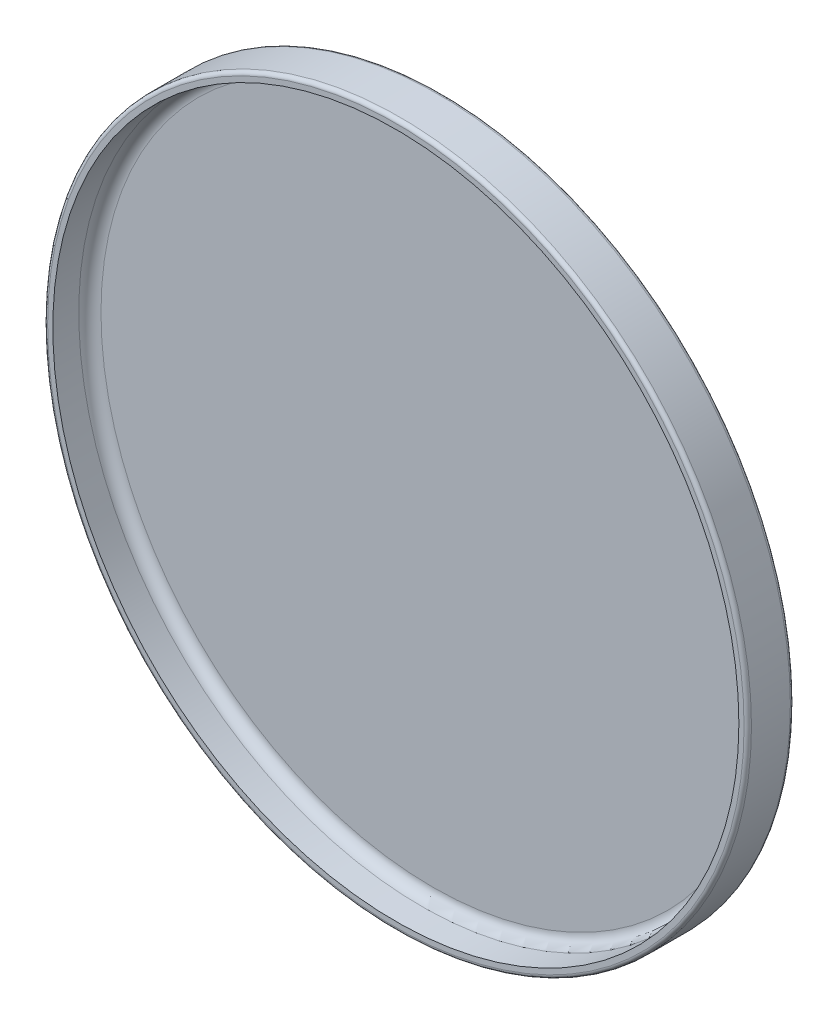
ISO-10303-21;
HEADER;
FILE_DESCRIPTION(('STEP AP214'),'2;1');
FILE_NAME('part.step','',(''),(''),'','','');
FILE_SCHEMA(('AUTOMOTIVE_DESIGN { 1 0 10303 214 1 1 1 1 }'));
ENDSEC;
DATA;
#1=APPLICATION_CONTEXT('core data for automotive mechanical design processes');
#2=APPLICATION_PROTOCOL_DEFINITION('international standard','automotive_design',2000,#1);
#3=PRODUCT_CONTEXT('',#1,'mechanical');
#4=PRODUCT('Part','Part','',(#3));
#5=PRODUCT_RELATED_PRODUCT_CATEGORY('part','',(#4));
#6=PRODUCT_DEFINITION_FORMATION('','',#4);
#7=PRODUCT_DEFINITION_CONTEXT('part definition',#1,'design');
#8=PRODUCT_DEFINITION('design','',#6,#7);
#9=PRODUCT_DEFINITION_SHAPE('','',#8);
#10=(LENGTH_UNIT() NAMED_UNIT(*) SI_UNIT(.MILLI.,.METRE.));
#11=(NAMED_UNIT(*) PLANE_ANGLE_UNIT() SI_UNIT($,.RADIAN.));
#12=(NAMED_UNIT(*) SI_UNIT($,.STERADIAN.) SOLID_ANGLE_UNIT());
#13=UNCERTAINTY_MEASURE_WITH_UNIT(LENGTH_MEASURE(1.E-05),#10,'distance_accuracy_value','');
#14=(GEOMETRIC_REPRESENTATION_CONTEXT(3) GLOBAL_UNCERTAINTY_ASSIGNED_CONTEXT((#13)) GLOBAL_UNIT_ASSIGNED_CONTEXT((#10,
#11,#12)) REPRESENTATION_CONTEXT('',''));
#15=CARTESIAN_POINT('',(0.,0.,0.));
#16=DIRECTION('',(0.,0.,1.));
#17=DIRECTION('',(1.,0.,0.));
#18=AXIS2_PLACEMENT_3D('',#15,#16,#17);
#19=CARTESIAN_POINT('',(0.,0.,-2.5));
#20=DIRECTION('',(0.,0.,1.));
#21=DIRECTION('',(1.,0.,0.));
#22=AXIS2_PLACEMENT_3D('',#19,#20,#21);
#23=CYLINDRICAL_SURFACE('',#22,95.);
#24=CARTESIAN_POINT('',(0.,0.,9.));
#25=DIRECTION('',(0.,0.,1.));
#26=DIRECTION('',(1.,0.,0.));
#27=AXIS2_PLACEMENT_3D('',#24,#25,#26);
#28=CIRCLE('',#27,95.);
#29=CARTESIAN_POINT('',(95.,0.,9.));
#30=VERTEX_POINT('',#29);
#31=EDGE_CURVE('E43',#30,#30,#28,.F.);
#32=ORIENTED_EDGE('',*,*,#31,.T.);
#33=EDGE_LOOP('',(#32));
#34=FACE_BOUND('',#33,.T.);
#35=CARTESIAN_POINT('',(0.,0.,-1.5));
#36=DIRECTION('',(0.,0.,1.));
#37=DIRECTION('',(1.,0.,0.));
#38=AXIS2_PLACEMENT_3D('',#35,#36,#37);
#39=CIRCLE('',#38,95.);
#40=CARTESIAN_POINT('',(95.,0.,-1.5));
#41=VERTEX_POINT('',#40);
#42=EDGE_CURVE('E55',#41,#41,#39,.T.);
#43=ORIENTED_EDGE('',*,*,#42,.T.);
#44=EDGE_LOOP('',(#43));
#45=FACE_BOUND('',#44,.T.);
#46=ADVANCED_FACE('F32',(#34,#45),#23,.T.);
#47=CARTESIAN_POINT('',(0.,0.,-2.5));
#48=DIRECTION('',(0.,0.,1.));
#49=DIRECTION('',(1.,0.,0.));
#50=AXIS2_PLACEMENT_3D('',#47,#48,#49);
#51=PLANE('',#50);
#52=CARTESIAN_POINT('',(0.,0.,-2.5));
#53=DIRECTION('',(0.,0.,1.));
#54=DIRECTION('',(1.,0.,0.));
#55=AXIS2_PLACEMENT_3D('',#52,#53,#54);
#56=CIRCLE('',#55,94.);
#57=CARTESIAN_POINT('',(94.,0.,-2.5));
#58=VERTEX_POINT('',#57);
#59=EDGE_CURVE('E52',#58,#58,#56,.F.);
#60=ORIENTED_EDGE('',*,*,#59,.T.);
#61=EDGE_LOOP('',(#60));
#62=FACE_BOUND('',#61,.T.);
#63=ADVANCED_FACE('F75',(#62),#51,.F.);
#64=CARTESIAN_POINT('',(0.,0.,10.));
#65=DIRECTION('',(0.,0.,-1.));
#66=DIRECTION('',(-1.,0.,0.));
#67=AXIS2_PLACEMENT_3D('',#64,#65,#66);
#68=CYLINDRICAL_SURFACE('',#67,92.6);
#69=CARTESIAN_POINT('',(0.,0.,3.));
#70=DIRECTION('',(0.,0.,1.));
#71=DIRECTION('',(1.,0.,0.));
#72=AXIS2_PLACEMENT_3D('',#69,#70,#71);
#73=CIRCLE('',#72,92.6);
#74=CARTESIAN_POINT('',(92.6,0.,3.));
#75=VERTEX_POINT('',#74);
#76=EDGE_CURVE('E39',#75,#75,#73,.F.);
#77=ORIENTED_EDGE('',*,*,#76,.T.);
#78=EDGE_LOOP('',(#77));
#79=FACE_BOUND('',#78,.T.);
#80=CARTESIAN_POINT('',(0.,0.,10.));
#81=DIRECTION('',(0.,0.,1.));
#82=DIRECTION('',(1.,0.,0.));
#83=AXIS2_PLACEMENT_3D('',#80,#81,#82);
#84=CIRCLE('',#83,92.6);
#85=CARTESIAN_POINT('',(92.6,0.,10.));
#86=VERTEX_POINT('',#85);
#87=EDGE_CURVE('E58',#86,#86,#84,.T.);
#88=ORIENTED_EDGE('',*,*,#87,.T.);
#89=EDGE_LOOP('',(#88));
#90=FACE_BOUND('',#89,.T.);
#91=ADVANCED_FACE('F62',(#79,#90),#68,.F.);
#92=CARTESIAN_POINT('',(0.,0.,10.));
#93=DIRECTION('',(0.,0.,1.));
#94=DIRECTION('',(1.,0.,0.));
#95=AXIS2_PLACEMENT_3D('',#92,#93,#94);
#96=PLANE('',#95);
#97=CARTESIAN_POINT('',(0.,0.,10.));
#98=DIRECTION('',(0.,0.,1.));
#99=DIRECTION('',(1.,0.,0.));
#100=AXIS2_PLACEMENT_3D('',#97,#98,#99);
#101=CIRCLE('',#100,94.);
#102=CARTESIAN_POINT('',(94.,0.,10.));
#103=VERTEX_POINT('',#102);
#104=EDGE_CURVE('E47',#103,#103,#101,.T.);
#105=ORIENTED_EDGE('',*,*,#104,.T.);
#106=EDGE_LOOP('',(#105));
#107=FACE_BOUND('',#106,.T.);
#108=ORIENTED_EDGE('',*,*,#87,.F.);
#109=EDGE_LOOP('',(#108));
#110=FACE_BOUND('',#109,.T.);
#111=ADVANCED_FACE('F64',(#107,#110),#96,.T.);
#112=CARTESIAN_POINT('',(0.,0.,0.));
#113=DIRECTION('',(0.,0.,1.));
#114=DIRECTION('',(1.,0.,0.));
#115=AXIS2_PLACEMENT_3D('',#112,#113,#114);
#116=PLANE('',#115);
#117=CARTESIAN_POINT('',(0.,0.,0.));
#118=DIRECTION('',(0.,0.,1.));
#119=DIRECTION('',(1.,0.,0.));
#120=AXIS2_PLACEMENT_3D('',#117,#118,#119);
#121=CIRCLE('',#120,89.6);
#122=CARTESIAN_POINT('',(89.6,0.,0.));
#123=VERTEX_POINT('',#122);
#124=EDGE_CURVE('E10',#123,#123,#121,.T.);
#125=ORIENTED_EDGE('',*,*,#124,.T.);
#126=EDGE_LOOP('',(#125));
#127=FACE_BOUND('',#126,.T.);
#128=ADVANCED_FACE('F66',(#127),#116,.T.);
#129=CARTESIAN_POINT('',(0.,0.,-1.5));
#130=DIRECTION('',(0.,0.,1.));
#131=DIRECTION('',(1.,0.,0.));
#132=AXIS2_PLACEMENT_3D('',#129,#130,#131);
#133=TOROIDAL_SURFACE('',#132,94.,1.);
#134=ORIENTED_EDGE('',*,*,#59,.F.);
#135=EDGE_LOOP('',(#134));
#136=FACE_BOUND('',#135,.T.);
#137=ORIENTED_EDGE('',*,*,#42,.F.);
#138=EDGE_LOOP('',(#137));
#139=FACE_BOUND('',#138,.T.);
#140=ADVANCED_FACE('F73',(#136,#139),#133,.T.);
#141=CARTESIAN_POINT('',(0.,0.,9.));
#142=DIRECTION('',(0.,0.,1.));
#143=DIRECTION('',(1.,0.,0.));
#144=AXIS2_PLACEMENT_3D('',#141,#142,#143);
#145=TOROIDAL_SURFACE('',#144,94.,1.);
#146=ORIENTED_EDGE('',*,*,#31,.F.);
#147=EDGE_LOOP('',(#146));
#148=FACE_BOUND('',#147,.T.);
#149=ORIENTED_EDGE('',*,*,#104,.F.);
#150=EDGE_LOOP('',(#149));
#151=FACE_BOUND('',#150,.T.);
#152=ADVANCED_FACE('F88',(#148,#151),#145,.T.);
#153=CARTESIAN_POINT('',(0.,0.,3.));
#154=DIRECTION('',(0.,0.,1.));
#155=DIRECTION('',(1.,0.,0.));
#156=AXIS2_PLACEMENT_3D('',#153,#154,#155);
#157=TOROIDAL_SURFACE('',#156,89.6,3.);
#158=ORIENTED_EDGE('',*,*,#124,.F.);
#159=EDGE_LOOP('',(#158));
#160=FACE_BOUND('',#159,.T.);
#161=ORIENTED_EDGE('',*,*,#76,.F.);
#162=EDGE_LOOP('',(#161));
#163=FACE_BOUND('',#162,.T.);
#164=ADVANCED_FACE('F34',(#160,#163),#157,.F.);
#165=CLOSED_SHELL('',(#46,#63,#91,#111,#128,#140,#152,#164));
#166=MANIFOLD_SOLID_BREP('B2',#165);
#167=ADVANCED_BREP_SHAPE_REPRESENTATION('',(#18,#166),#14);
#168=SHAPE_DEFINITION_REPRESENTATION(#9,#167);
ENDSEC;
END-ISO-10303-21;
